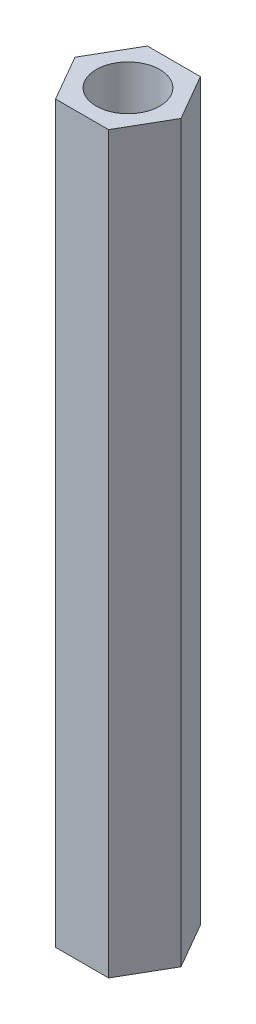
ISO-10303-21;
HEADER;
FILE_DESCRIPTION(('STEP AP214'),'2;1');
FILE_NAME('part.step','',(''),(''),'','','');
FILE_SCHEMA(('AUTOMOTIVE_DESIGN { 1 0 10303 214 1 1 1 1 }'));
ENDSEC;
DATA;
#1=APPLICATION_CONTEXT('core data for automotive mechanical design processes');
#2=APPLICATION_PROTOCOL_DEFINITION('international standard','automotive_design',2000,#1);
#3=PRODUCT_CONTEXT('',#1,'mechanical');
#4=PRODUCT('Part','Part','',(#3));
#5=PRODUCT_RELATED_PRODUCT_CATEGORY('part','',(#4));
#6=PRODUCT_DEFINITION_FORMATION('','',#4);
#7=PRODUCT_DEFINITION_CONTEXT('part definition',#1,'design');
#8=PRODUCT_DEFINITION('design','',#6,#7);
#9=PRODUCT_DEFINITION_SHAPE('','',#8);
#10=(LENGTH_UNIT() NAMED_UNIT(*) SI_UNIT(.MILLI.,.METRE.));
#11=(NAMED_UNIT(*) PLANE_ANGLE_UNIT() SI_UNIT($,.RADIAN.));
#12=(NAMED_UNIT(*) SI_UNIT($,.STERADIAN.) SOLID_ANGLE_UNIT());
#13=UNCERTAINTY_MEASURE_WITH_UNIT(LENGTH_MEASURE(1.E-05),#10,'distance_accuracy_value','');
#14=(GEOMETRIC_REPRESENTATION_CONTEXT(3) GLOBAL_UNCERTAINTY_ASSIGNED_CONTEXT((#13)) GLOBAL_UNIT_ASSIGNED_CONTEXT((#10,
#11,#12)) REPRESENTATION_CONTEXT('',''));
#15=CARTESIAN_POINT('',(0.,0.,0.));
#16=DIRECTION('',(0.,0.,1.));
#17=DIRECTION('',(1.,0.,0.));
#18=AXIS2_PLACEMENT_3D('',#15,#16,#17);
#19=CARTESIAN_POINT('',(0.,0.,0.));
#20=DIRECTION('',(0.,1.,0.));
#21=DIRECTION('',(0.,0.,1.));
#22=AXIS2_PLACEMENT_3D('',#19,#20,#21);
#23=PLANE('',#22);
#24=DIRECTION('',(-0.5,0.,-0.866025403784438));
#25=VECTOR('',#24,1.);
#26=CARTESIAN_POINT('',(3.66617420935412,0.,0.));
#27=LINE('',#26,#25);
#28=CARTESIAN_POINT('',(3.66617420935412,0.,0.));
#29=VERTEX_POINT('',#28);
#30=CARTESIAN_POINT('',(1.83308710467706,0.,-3.175));
#31=VERTEX_POINT('',#30);
#32=EDGE_CURVE('E129',#29,#31,#27,.T.);
#33=ORIENTED_EDGE('',*,*,#32,.F.);
#34=DIRECTION('',(0.5,0.,-0.866025403784439));
#35=VECTOR('',#34,1.);
#36=CARTESIAN_POINT('',(1.83308710467706,0.,3.175));
#37=LINE('',#36,#35);
#38=CARTESIAN_POINT('',(1.83308710467706,0.,3.175));
#39=VERTEX_POINT('',#38);
#40=EDGE_CURVE('E86',#39,#29,#37,.T.);
#41=ORIENTED_EDGE('',*,*,#40,.F.);
#42=DIRECTION('',(1.,0.,0.));
#43=VECTOR('',#42,1.);
#44=CARTESIAN_POINT('',(-1.83308710467706,0.,3.175));
#45=LINE('',#44,#43);
#46=CARTESIAN_POINT('',(-1.83308710467706,0.,3.175));
#47=VERTEX_POINT('',#46);
#48=EDGE_CURVE('E80',#47,#39,#45,.T.);
#49=ORIENTED_EDGE('',*,*,#48,.F.);
#50=DIRECTION('',(0.5,0.,0.866025403784439));
#51=VECTOR('',#50,1.);
#52=CARTESIAN_POINT('',(-3.66617420935412,0.,0.));
#53=LINE('',#52,#51);
#54=CARTESIAN_POINT('',(-3.66617420935412,0.,0.));
#55=VERTEX_POINT('',#54);
#56=EDGE_CURVE('E116',#55,#47,#53,.T.);
#57=ORIENTED_EDGE('',*,*,#56,.F.);
#58=DIRECTION('',(-0.5,0.,0.866025403784439));
#59=VECTOR('',#58,1.);
#60=CARTESIAN_POINT('',(-1.83308710467706,0.,-3.175));
#61=LINE('',#60,#59);
#62=CARTESIAN_POINT('',(-1.83308710467706,0.,-3.175));
#63=VERTEX_POINT('',#62);
#64=EDGE_CURVE('E137',#63,#55,#61,.T.);
#65=ORIENTED_EDGE('',*,*,#64,.F.);
#66=DIRECTION('',(-1.,0.,0.));
#67=VECTOR('',#66,1.);
#68=CARTESIAN_POINT('',(1.83308710467706,0.,-3.175));
#69=LINE('',#68,#67);
#70=EDGE_CURVE('E133',#31,#63,#69,.T.);
#71=ORIENTED_EDGE('',*,*,#70,.F.);
#72=EDGE_LOOP('',(#33,#41,#49,#57,#65,#71));
#73=FACE_BOUND('',#72,.T.);
#74=CARTESIAN_POINT('',(0.,0.,0.));
#75=DIRECTION('',(0.,1.,0.));
#76=DIRECTION('',(0.,0.,1.));
#77=AXIS2_PLACEMENT_3D('',#74,#75,#76);
#78=CIRCLE('',#77,2.19709999999998);
#79=CARTESIAN_POINT('',(0.,0.,2.19709999999998));
#80=VERTEX_POINT('',#79);
#81=EDGE_CURVE('E134',#80,#80,#78,.F.);
#82=ORIENTED_EDGE('',*,*,#81,.F.);
#83=EDGE_LOOP('',(#82));
#84=FACE_BOUND('',#83,.T.);
#85=ADVANCED_FACE('F39',(#73,#84),#23,.F.);
#86=CARTESIAN_POINT('',(3.66617420935412,50.8,0.));
#87=DIRECTION('',(-0.866025403784438,0.,0.5));
#88=DIRECTION('',(0.5,0.,0.866025403784439));
#89=AXIS2_PLACEMENT_3D('',#86,#87,#88);
#90=PLANE('',#89);
#91=ORIENTED_EDGE('',*,*,#32,.T.);
#92=DIRECTION('',(0.,-1.,0.));
#93=VECTOR('',#92,1.);
#94=CARTESIAN_POINT('',(1.83308710467706,50.8,-3.175));
#95=LINE('',#94,#93);
#96=CARTESIAN_POINT('',(1.83308710467706,50.8,-3.175));
#97=VERTEX_POINT('',#96);
#98=EDGE_CURVE('E11',#97,#31,#95,.T.);
#99=ORIENTED_EDGE('',*,*,#98,.F.);
#100=DIRECTION('',(-0.5,0.,-0.866025403784438));
#101=VECTOR('',#100,1.);
#102=CARTESIAN_POINT('',(3.66617420935412,50.8,0.));
#103=LINE('',#102,#101);
#104=CARTESIAN_POINT('',(3.66617420935412,50.8,0.));
#105=VERTEX_POINT('',#104);
#106=EDGE_CURVE('E146',#105,#97,#103,.T.);
#107=ORIENTED_EDGE('',*,*,#106,.F.);
#108=DIRECTION('',(0.,-1.,0.));
#109=VECTOR('',#108,1.);
#110=CARTESIAN_POINT('',(3.66617420935412,50.8,0.));
#111=LINE('',#110,#109);
#112=EDGE_CURVE('E125',#105,#29,#111,.T.);
#113=ORIENTED_EDGE('',*,*,#112,.T.);
#114=EDGE_LOOP('',(#91,#99,#107,#113));
#115=FACE_BOUND('',#114,.T.);
#116=ADVANCED_FACE('F41',(#115),#90,.F.);
#117=CARTESIAN_POINT('',(1.83308710467706,50.8,-3.175));
#118=DIRECTION('',(0.,0.,1.));
#119=DIRECTION('',(1.,0.,0.));
#120=AXIS2_PLACEMENT_3D('',#117,#118,#119);
#121=PLANE('',#120);
#122=ORIENTED_EDGE('',*,*,#70,.T.);
#123=DIRECTION('',(0.,-1.,0.));
#124=VECTOR('',#123,1.);
#125=CARTESIAN_POINT('',(-1.83308710467706,50.8,-3.175));
#126=LINE('',#125,#124);
#127=CARTESIAN_POINT('',(-1.83308710467706,50.8,-3.175));
#128=VERTEX_POINT('',#127);
#129=EDGE_CURVE('E49',#128,#63,#126,.T.);
#130=ORIENTED_EDGE('',*,*,#129,.F.);
#131=DIRECTION('',(-1.,0.,0.));
#132=VECTOR('',#131,1.);
#133=CARTESIAN_POINT('',(1.83308710467706,50.8,-3.175));
#134=LINE('',#133,#132);
#135=EDGE_CURVE('E94',#97,#128,#134,.T.);
#136=ORIENTED_EDGE('',*,*,#135,.F.);
#137=ORIENTED_EDGE('',*,*,#98,.T.);
#138=EDGE_LOOP('',(#122,#130,#136,#137));
#139=FACE_BOUND('',#138,.T.);
#140=ADVANCED_FACE('F179',(#139),#121,.F.);
#141=CARTESIAN_POINT('',(-1.83308710467706,50.8,-3.175));
#142=DIRECTION('',(0.866025403784439,0.,0.5));
#143=DIRECTION('',(0.5,0.,-0.866025403784439));
#144=AXIS2_PLACEMENT_3D('',#141,#142,#143);
#145=PLANE('',#144);
#146=ORIENTED_EDGE('',*,*,#64,.T.);
#147=DIRECTION('',(0.,-1.,0.));
#148=VECTOR('',#147,1.);
#149=CARTESIAN_POINT('',(-3.66617420935412,50.8,0.));
#150=LINE('',#149,#148);
#151=CARTESIAN_POINT('',(-3.66617420935412,50.8,0.));
#152=VERTEX_POINT('',#151);
#153=EDGE_CURVE('E118',#152,#55,#150,.T.);
#154=ORIENTED_EDGE('',*,*,#153,.F.);
#155=DIRECTION('',(-0.5,0.,0.866025403784439));
#156=VECTOR('',#155,1.);
#157=CARTESIAN_POINT('',(-1.83308710467706,50.8,-3.175));
#158=LINE('',#157,#156);
#159=EDGE_CURVE('E107',#128,#152,#158,.T.);
#160=ORIENTED_EDGE('',*,*,#159,.F.);
#161=ORIENTED_EDGE('',*,*,#129,.T.);
#162=EDGE_LOOP('',(#146,#154,#160,#161));
#163=FACE_BOUND('',#162,.T.);
#164=ADVANCED_FACE('F156',(#163),#145,.F.);
#165=CARTESIAN_POINT('',(-3.66617420935412,50.8,0.));
#166=DIRECTION('',(0.866025403784439,0.,-0.5));
#167=DIRECTION('',(-0.5,0.,-0.866025403784439));
#168=AXIS2_PLACEMENT_3D('',#165,#166,#167);
#169=PLANE('',#168);
#170=ORIENTED_EDGE('',*,*,#56,.T.);
#171=DIRECTION('',(0.,-1.,0.));
#172=VECTOR('',#171,1.);
#173=CARTESIAN_POINT('',(-1.83308710467706,50.8,3.175));
#174=LINE('',#173,#172);
#175=CARTESIAN_POINT('',(-1.83308710467706,50.8,3.175));
#176=VERTEX_POINT('',#175);
#177=EDGE_CURVE('E113',#176,#47,#174,.T.);
#178=ORIENTED_EDGE('',*,*,#177,.F.);
#179=DIRECTION('',(0.5,0.,0.866025403784439));
#180=VECTOR('',#179,1.);
#181=CARTESIAN_POINT('',(-3.66617420935412,50.8,0.));
#182=LINE('',#181,#180);
#183=EDGE_CURVE('E101',#152,#176,#182,.T.);
#184=ORIENTED_EDGE('',*,*,#183,.F.);
#185=ORIENTED_EDGE('',*,*,#153,.T.);
#186=EDGE_LOOP('',(#170,#178,#184,#185));
#187=FACE_BOUND('',#186,.T.);
#188=ADVANCED_FACE('F114',(#187),#169,.F.);
#189=CARTESIAN_POINT('',(-1.83308710467706,50.8,3.175));
#190=DIRECTION('',(0.,0.,-1.));
#191=DIRECTION('',(-1.,0.,0.));
#192=AXIS2_PLACEMENT_3D('',#189,#190,#191);
#193=PLANE('',#192);
#194=ORIENTED_EDGE('',*,*,#48,.T.);
#195=DIRECTION('',(0.,-1.,0.));
#196=VECTOR('',#195,1.);
#197=CARTESIAN_POINT('',(1.83308710467706,50.8,3.175));
#198=LINE('',#197,#196);
#199=CARTESIAN_POINT('',(1.83308710467706,50.8,3.175));
#200=VERTEX_POINT('',#199);
#201=EDGE_CURVE('E119',#200,#39,#198,.T.);
#202=ORIENTED_EDGE('',*,*,#201,.F.);
#203=DIRECTION('',(1.,0.,0.));
#204=VECTOR('',#203,1.);
#205=CARTESIAN_POINT('',(-1.83308710467706,50.8,3.175));
#206=LINE('',#205,#204);
#207=EDGE_CURVE('E105',#176,#200,#206,.T.);
#208=ORIENTED_EDGE('',*,*,#207,.F.);
#209=ORIENTED_EDGE('',*,*,#177,.T.);
#210=EDGE_LOOP('',(#194,#202,#208,#209));
#211=FACE_BOUND('',#210,.T.);
#212=ADVANCED_FACE('F121',(#211),#193,.F.);
#213=CARTESIAN_POINT('',(1.83308710467706,50.8,3.175));
#214=DIRECTION('',(-0.866025403784439,0.,-0.5));
#215=DIRECTION('',(-0.5,0.,0.866025403784439));
#216=AXIS2_PLACEMENT_3D('',#213,#214,#215);
#217=PLANE('',#216);
#218=ORIENTED_EDGE('',*,*,#40,.T.);
#219=ORIENTED_EDGE('',*,*,#112,.F.);
#220=DIRECTION('',(0.5,0.,-0.866025403784439));
#221=VECTOR('',#220,1.);
#222=CARTESIAN_POINT('',(1.83308710467706,50.8,3.175));
#223=LINE('',#222,#221);
#224=EDGE_CURVE('E57',#200,#105,#223,.T.);
#225=ORIENTED_EDGE('',*,*,#224,.F.);
#226=ORIENTED_EDGE('',*,*,#201,.T.);
#227=EDGE_LOOP('',(#218,#219,#225,#226));
#228=FACE_BOUND('',#227,.T.);
#229=ADVANCED_FACE('F163',(#228),#217,.F.);
#230=CARTESIAN_POINT('',(0.,50.8,0.));
#231=DIRECTION('',(0.,1.,0.));
#232=DIRECTION('',(0.,0.,1.));
#233=AXIS2_PLACEMENT_3D('',#230,#231,#232);
#234=PLANE('',#233);
#235=CARTESIAN_POINT('',(0.,50.8,0.));
#236=DIRECTION('',(0.,1.,0.));
#237=DIRECTION('',(0.,0.,1.));
#238=AXIS2_PLACEMENT_3D('',#235,#236,#237);
#239=CIRCLE('',#238,2.19709999999999);
#240=CARTESIAN_POINT('',(0.,50.8,2.19709999999999));
#241=VERTEX_POINT('',#240);
#242=EDGE_CURVE('E190',#241,#241,#239,.T.);
#243=ORIENTED_EDGE('',*,*,#242,.F.);
#244=EDGE_LOOP('',(#243));
#245=FACE_BOUND('',#244,.T.);
#246=ORIENTED_EDGE('',*,*,#106,.T.);
#247=ORIENTED_EDGE('',*,*,#135,.T.);
#248=ORIENTED_EDGE('',*,*,#159,.T.);
#249=ORIENTED_EDGE('',*,*,#183,.T.);
#250=ORIENTED_EDGE('',*,*,#207,.T.);
#251=ORIENTED_EDGE('',*,*,#224,.T.);
#252=EDGE_LOOP('',(#246,#247,#248,#249,#250,#251));
#253=FACE_BOUND('',#252,.T.);
#254=ADVANCED_FACE('F103',(#245,#253),#234,.T.);
#255=CARTESIAN_POINT('',(0.,50.8,0.));
#256=DIRECTION('',(0.,1.,0.));
#257=DIRECTION('',(0.,0.,1.));
#258=AXIS2_PLACEMENT_3D('',#255,#256,#257);
#259=CYLINDRICAL_SURFACE('',#258,2.19709999999998);
#260=ORIENTED_EDGE('',*,*,#81,.T.);
#261=EDGE_LOOP('',(#260));
#262=FACE_BOUND('',#261,.T.);
#263=ORIENTED_EDGE('',*,*,#242,.T.);
#264=EDGE_LOOP('',(#263));
#265=FACE_BOUND('',#264,.T.);
#266=ADVANCED_FACE('F170',(#262,#265),#259,.F.);
#267=CLOSED_SHELL('',(#85,#116,#140,#164,#188,#212,#229,#254,#266));
#268=MANIFOLD_SOLID_BREP('B2',#267);
#269=ADVANCED_BREP_SHAPE_REPRESENTATION('',(#18,#268),#14);
#270=SHAPE_DEFINITION_REPRESENTATION(#9,#269);
ENDSEC;
END-ISO-10303-21;
